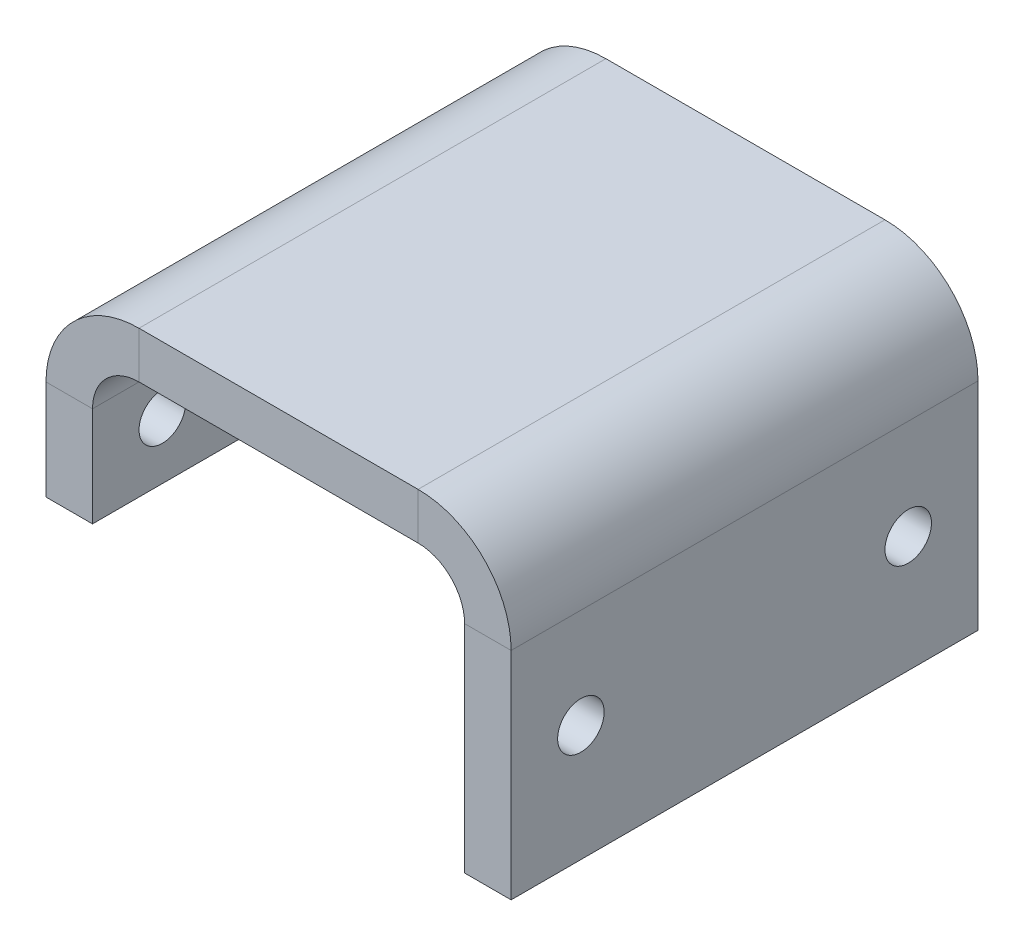
ISO-10303-21;
HEADER;
FILE_DESCRIPTION(('STEP AP214'),'2;1');
FILE_NAME('part.step','',(''),(''),'','','');
FILE_SCHEMA(('AUTOMOTIVE_DESIGN { 1 0 10303 214 1 1 1 1 }'));
ENDSEC;
DATA;
#1=APPLICATION_CONTEXT('core data for automotive mechanical design processes');
#2=APPLICATION_PROTOCOL_DEFINITION('international standard','automotive_design',2000,#1);
#3=PRODUCT_CONTEXT('',#1,'mechanical');
#4=PRODUCT('Part','Part','',(#3));
#5=PRODUCT_RELATED_PRODUCT_CATEGORY('part','',(#4));
#6=PRODUCT_DEFINITION_FORMATION('','',#4);
#7=PRODUCT_DEFINITION_CONTEXT('part definition',#1,'design');
#8=PRODUCT_DEFINITION('design','',#6,#7);
#9=PRODUCT_DEFINITION_SHAPE('','',#8);
#10=(LENGTH_UNIT() NAMED_UNIT(*) SI_UNIT(.MILLI.,.METRE.));
#11=(NAMED_UNIT(*) PLANE_ANGLE_UNIT() SI_UNIT($,.RADIAN.));
#12=(NAMED_UNIT(*) SI_UNIT($,.STERADIAN.) SOLID_ANGLE_UNIT());
#13=UNCERTAINTY_MEASURE_WITH_UNIT(LENGTH_MEASURE(1.E-05),#10,'distance_accuracy_value','');
#14=(GEOMETRIC_REPRESENTATION_CONTEXT(3) GLOBAL_UNCERTAINTY_ASSIGNED_CONTEXT((#13)) GLOBAL_UNIT_ASSIGNED_CONTEXT((#10,
#11,#12)) REPRESENTATION_CONTEXT('',''));
#15=CARTESIAN_POINT('',(0.,0.,0.));
#16=DIRECTION('',(0.,0.,1.));
#17=DIRECTION('',(1.,0.,0.));
#18=AXIS2_PLACEMENT_3D('',#15,#16,#17);
#19=CARTESIAN_POINT('',(-35.,-4.,20.075));
#20=DIRECTION('',(0.,0.,1.));
#21=DIRECTION('',(1.,0.,0.));
#22=AXIS2_PLACEMENT_3D('',#19,#20,#21);
#23=PLANE('',#22);
#24=DIRECTION('',(1.,0.,0.));
#25=VECTOR('',#24,1.);
#26=CARTESIAN_POINT('',(-35.,-4.,20.075));
#27=LINE('',#26,#25);
#28=CARTESIAN_POINT('',(-17.,-4.,20.075));
#29=VERTEX_POINT('',#28);
#30=CARTESIAN_POINT('',(7.00000000000003,-4.,20.075));
#31=VERTEX_POINT('',#30);
#32=EDGE_CURVE('E221',#29,#31,#27,.T.);
#33=ORIENTED_EDGE('',*,*,#32,.T.);
#34=DIRECTION('',(0.,1.,0.));
#35=VECTOR('',#34,1.);
#36=CARTESIAN_POINT('',(7.00000000000003,-4.,20.075));
#37=LINE('',#36,#35);
#38=CARTESIAN_POINT('',(7.00000000000003,0.,20.075));
#39=VERTEX_POINT('',#38);
#40=EDGE_CURVE('E12',#31,#39,#37,.T.);
#41=ORIENTED_EDGE('',*,*,#40,.T.);
#42=DIRECTION('',(1.,0.,0.));
#43=VECTOR('',#42,1.);
#44=CARTESIAN_POINT('',(-35.,0.,20.075));
#45=LINE('',#44,#43);
#46=CARTESIAN_POINT('',(-17.,0.,20.075));
#47=VERTEX_POINT('',#46);
#48=EDGE_CURVE('E205',#47,#39,#45,.T.);
#49=ORIENTED_EDGE('',*,*,#48,.F.);
#50=DIRECTION('',(0.,1.,0.));
#51=VECTOR('',#50,1.);
#52=CARTESIAN_POINT('',(-17.,-4.,20.075));
#53=LINE('',#52,#51);
#54=EDGE_CURVE('E210',#29,#47,#53,.T.);
#55=ORIENTED_EDGE('',*,*,#54,.F.);
#56=EDGE_LOOP('',(#33,#41,#49,#55));
#57=FACE_BOUND('',#56,.T.);
#58=ADVANCED_FACE('F47',(#57),#23,.T.);
#59=CARTESIAN_POINT('',(-35.,-4.,-20.075));
#60=DIRECTION('',(0.,0.,-1.));
#61=DIRECTION('',(-1.,0.,0.));
#62=AXIS2_PLACEMENT_3D('',#59,#60,#61);
#63=PLANE('',#62);
#64=DIRECTION('',(-1.,0.,0.));
#65=VECTOR('',#64,1.);
#66=CARTESIAN_POINT('',(-35.,0.,-20.075));
#67=LINE('',#66,#65);
#68=CARTESIAN_POINT('',(7.00000000000003,0.,-20.075));
#69=VERTEX_POINT('',#68);
#70=CARTESIAN_POINT('',(-17.,0.,-20.075));
#71=VERTEX_POINT('',#70);
#72=EDGE_CURVE('E206',#69,#71,#67,.T.);
#73=ORIENTED_EDGE('',*,*,#72,.F.);
#74=DIRECTION('',(0.,-1.,0.));
#75=VECTOR('',#74,1.);
#76=CARTESIAN_POINT('',(7.00000000000003,-4.,-20.075));
#77=LINE('',#76,#75);
#78=CARTESIAN_POINT('',(7.00000000000003,-4.,-20.075));
#79=VERTEX_POINT('',#78);
#80=EDGE_CURVE('E262',#69,#79,#77,.T.);
#81=ORIENTED_EDGE('',*,*,#80,.T.);
#82=DIRECTION('',(-1.,0.,0.));
#83=VECTOR('',#82,1.);
#84=CARTESIAN_POINT('',(-35.,-4.,-20.075));
#85=LINE('',#84,#83);
#86=CARTESIAN_POINT('',(-17.,-4.,-20.075));
#87=VERTEX_POINT('',#86);
#88=EDGE_CURVE('E50',#79,#87,#85,.T.);
#89=ORIENTED_EDGE('',*,*,#88,.T.);
#90=DIRECTION('',(0.,-1.,0.));
#91=VECTOR('',#90,1.);
#92=CARTESIAN_POINT('',(-17.,-4.,-20.075));
#93=LINE('',#92,#91);
#94=EDGE_CURVE('E207',#71,#87,#93,.T.);
#95=ORIENTED_EDGE('',*,*,#94,.F.);
#96=EDGE_LOOP('',(#73,#81,#89,#95));
#97=FACE_BOUND('',#96,.T.);
#98=ADVANCED_FACE('F275',(#97),#63,.T.);
#99=CARTESIAN_POINT('',(0.,-4.,0.));
#100=DIRECTION('',(0.,-1.,0.));
#101=DIRECTION('',(0.,0.,-1.));
#102=AXIS2_PLACEMENT_3D('',#99,#100,#101);
#103=PLANE('',#102);
#104=ORIENTED_EDGE('',*,*,#88,.F.);
#105=DIRECTION('',(0.,0.,1.));
#106=VECTOR('',#105,1.);
#107=CARTESIAN_POINT('',(7.00000000000003,-4.,0.));
#108=LINE('',#107,#106);
#109=EDGE_CURVE('E253',#79,#31,#108,.T.);
#110=ORIENTED_EDGE('',*,*,#109,.T.);
#111=ORIENTED_EDGE('',*,*,#32,.F.);
#112=DIRECTION('',(0.,0.,1.));
#113=VECTOR('',#112,1.);
#114=CARTESIAN_POINT('',(-17.,-4.,0.));
#115=LINE('',#114,#113);
#116=EDGE_CURVE('E197',#87,#29,#115,.T.);
#117=ORIENTED_EDGE('',*,*,#116,.F.);
#118=EDGE_LOOP('',(#104,#110,#111,#117));
#119=FACE_BOUND('',#118,.T.);
#120=ADVANCED_FACE('F278',(#119),#103,.T.);
#121=CARTESIAN_POINT('',(-21.,-16.5752220392306,20.075));
#122=DIRECTION('',(0.,0.,1.));
#123=DIRECTION('',(0.,1.,0.));
#124=AXIS2_PLACEMENT_3D('',#121,#122,#123);
#125=PLANE('',#124);
#126=DIRECTION('',(0.,1.,0.));
#127=VECTOR('',#126,1.);
#128=CARTESIAN_POINT('',(-21.,-16.5752220392306,20.075));
#129=LINE('',#128,#127);
#130=CARTESIAN_POINT('',(-21.,-16.5752220392306,20.075));
#131=VERTEX_POINT('',#130);
#132=CARTESIAN_POINT('',(-21.,-8.00000000000001,20.075));
#133=VERTEX_POINT('',#132);
#134=EDGE_CURVE('E231',#131,#133,#129,.T.);
#135=ORIENTED_EDGE('',*,*,#134,.T.);
#136=DIRECTION('',(-1.,0.,0.));
#137=VECTOR('',#136,1.);
#138=CARTESIAN_POINT('',(-21.,-8.00000000000001,20.075));
#139=LINE('',#138,#137);
#140=CARTESIAN_POINT('',(-25.,-8.00000000000004,20.075));
#141=VERTEX_POINT('',#140);
#142=EDGE_CURVE('E250',#133,#141,#139,.T.);
#143=ORIENTED_EDGE('',*,*,#142,.T.);
#144=DIRECTION('',(0.,1.,0.));
#145=VECTOR('',#144,1.);
#146=CARTESIAN_POINT('',(-25.,-16.5752220392306,20.075));
#147=LINE('',#146,#145);
#148=CARTESIAN_POINT('',(-25.,-16.5752220392306,20.075));
#149=VERTEX_POINT('',#148);
#150=EDGE_CURVE('E236',#149,#141,#147,.T.);
#151=ORIENTED_EDGE('',*,*,#150,.F.);
#152=DIRECTION('',(-1.,0.,0.));
#153=VECTOR('',#152,1.);
#154=CARTESIAN_POINT('',(-21.,-16.5752220392306,20.075));
#155=LINE('',#154,#153);
#156=EDGE_CURVE('E237',#131,#149,#155,.T.);
#157=ORIENTED_EDGE('',*,*,#156,.F.);
#158=EDGE_LOOP('',(#135,#143,#151,#157));
#159=FACE_BOUND('',#158,.T.);
#160=ADVANCED_FACE('F291',(#159),#125,.T.);
#161=CARTESIAN_POINT('',(-21.,-16.5752220392306,-20.075));
#162=DIRECTION('',(0.,0.,-1.));
#163=DIRECTION('',(0.,-1.,0.));
#164=AXIS2_PLACEMENT_3D('',#161,#162,#163);
#165=PLANE('',#164);
#166=DIRECTION('',(0.,-1.,0.));
#167=VECTOR('',#166,1.);
#168=CARTESIAN_POINT('',(-25.,-16.5752220392306,-20.075));
#169=LINE('',#168,#167);
#170=CARTESIAN_POINT('',(-25.,-8.00000000000004,-20.075));
#171=VERTEX_POINT('',#170);
#172=CARTESIAN_POINT('',(-25.,-16.5752220392306,-20.075));
#173=VERTEX_POINT('',#172);
#174=EDGE_CURVE('E225',#171,#173,#169,.T.);
#175=ORIENTED_EDGE('',*,*,#174,.F.);
#176=DIRECTION('',(1.,0.,0.));
#177=VECTOR('',#176,1.);
#178=CARTESIAN_POINT('',(-21.,-8.00000000000001,-20.075));
#179=LINE('',#178,#177);
#180=CARTESIAN_POINT('',(-21.,-8.00000000000002,-20.075));
#181=VERTEX_POINT('',#180);
#182=EDGE_CURVE('E245',#171,#181,#179,.T.);
#183=ORIENTED_EDGE('',*,*,#182,.T.);
#184=DIRECTION('',(0.,-1.,0.));
#185=VECTOR('',#184,1.);
#186=CARTESIAN_POINT('',(-21.,-16.5752220392306,-20.075));
#187=LINE('',#186,#185);
#188=CARTESIAN_POINT('',(-21.,-16.5752220392306,-20.075));
#189=VERTEX_POINT('',#188);
#190=EDGE_CURVE('E232',#181,#189,#187,.T.);
#191=ORIENTED_EDGE('',*,*,#190,.T.);
#192=DIRECTION('',(-1.,0.,0.));
#193=VECTOR('',#192,1.);
#194=CARTESIAN_POINT('',(-21.,-16.5752220392306,-20.075));
#195=LINE('',#194,#193);
#196=EDGE_CURVE('E240',#189,#173,#195,.T.);
#197=ORIENTED_EDGE('',*,*,#196,.T.);
#198=EDGE_LOOP('',(#175,#183,#191,#197));
#199=FACE_BOUND('',#198,.T.);
#200=ADVANCED_FACE('F299',(#199),#165,.T.);
#201=CARTESIAN_POINT('',(-21.0000000000001,18.4247779607694,0.));
#202=DIRECTION('',(1.,0.,0.));
#203=DIRECTION('',(0.,0.,-1.));
#204=AXIS2_PLACEMENT_3D('',#201,#202,#203);
#205=PLANE('',#204);
#206=CARTESIAN_POINT('',(-21.,-11.5752220392306,-14.075));
#207=DIRECTION('',(-1.,0.,0.));
#208=DIRECTION('',(0.,0.,1.));
#209=AXIS2_PLACEMENT_3D('',#206,#207,#208);
#210=CIRCLE('',#209,2.);
#211=CARTESIAN_POINT('',(-21.,-11.5752220392306,-12.075));
#212=VERTEX_POINT('',#211);
#213=EDGE_CURVE('E222',#212,#212,#210,.T.);
#214=ORIENTED_EDGE('',*,*,#213,.T.);
#215=EDGE_LOOP('',(#214));
#216=FACE_BOUND('',#215,.T.);
#217=CARTESIAN_POINT('',(-21.,-11.5752220392306,14.075));
#218=DIRECTION('',(-1.,0.,0.));
#219=DIRECTION('',(0.,0.,-1.));
#220=AXIS2_PLACEMENT_3D('',#217,#218,#219);
#221=CIRCLE('',#220,2.);
#222=CARTESIAN_POINT('',(-21.,-11.5752220392306,12.075));
#223=VERTEX_POINT('',#222);
#224=EDGE_CURVE('E214',#223,#223,#221,.T.);
#225=ORIENTED_EDGE('',*,*,#224,.T.);
#226=EDGE_LOOP('',(#225));
#227=FACE_BOUND('',#226,.T.);
#228=ORIENTED_EDGE('',*,*,#190,.F.);
#229=DIRECTION('',(0.,0.,1.));
#230=VECTOR('',#229,1.);
#231=CARTESIAN_POINT('',(-21.,-8.00000000000001,0.));
#232=LINE('',#231,#230);
#233=EDGE_CURVE('E239',#181,#133,#232,.T.);
#234=ORIENTED_EDGE('',*,*,#233,.T.);
#235=ORIENTED_EDGE('',*,*,#134,.F.);
#236=DIRECTION('',(0.,0.,1.));
#237=VECTOR('',#236,1.);
#238=CARTESIAN_POINT('',(-21.,-16.5752220392306,20.075));
#239=LINE('',#238,#237);
#240=EDGE_CURVE('E228',#189,#131,#239,.T.);
#241=ORIENTED_EDGE('',*,*,#240,.F.);
#242=EDGE_LOOP('',(#228,#234,#235,#241));
#243=FACE_BOUND('',#242,.T.);
#244=ADVANCED_FACE('F288',(#216,#227,#243),#205,.T.);
#245=CARTESIAN_POINT('',(-21.,-16.5752220392306,20.075));
#246=DIRECTION('',(0.,-1.,0.));
#247=DIRECTION('',(0.,0.,1.));
#248=AXIS2_PLACEMENT_3D('',#245,#246,#247);
#249=PLANE('',#248);
#250=DIRECTION('',(0.,0.,1.));
#251=VECTOR('',#250,1.);
#252=CARTESIAN_POINT('',(-25.,-16.5752220392306,20.075));
#253=LINE('',#252,#251);
#254=EDGE_CURVE('E233',#173,#149,#253,.T.);
#255=ORIENTED_EDGE('',*,*,#254,.F.);
#256=ORIENTED_EDGE('',*,*,#196,.F.);
#257=ORIENTED_EDGE('',*,*,#240,.T.);
#258=ORIENTED_EDGE('',*,*,#156,.T.);
#259=EDGE_LOOP('',(#255,#256,#257,#258));
#260=FACE_BOUND('',#259,.T.);
#261=ADVANCED_FACE('F296',(#260),#249,.T.);
#262=CARTESIAN_POINT('',(-25.0000000000001,18.4247779607694,0.));
#263=DIRECTION('',(1.,0.,0.));
#264=DIRECTION('',(0.,0.,-1.));
#265=AXIS2_PLACEMENT_3D('',#262,#263,#264);
#266=PLANE('',#265);
#267=DIRECTION('',(0.,0.,1.));
#268=VECTOR('',#267,1.);
#269=CARTESIAN_POINT('',(-25.,-8.00000000000003,0.));
#270=LINE('',#269,#268);
#271=EDGE_CURVE('E248',#171,#141,#270,.T.);
#272=ORIENTED_EDGE('',*,*,#271,.F.);
#273=ORIENTED_EDGE('',*,*,#174,.T.);
#274=ORIENTED_EDGE('',*,*,#254,.T.);
#275=ORIENTED_EDGE('',*,*,#150,.T.);
#276=EDGE_LOOP('',(#272,#273,#274,#275));
#277=FACE_BOUND('',#276,.T.);
#278=CARTESIAN_POINT('',(-25.,-11.5752220392306,14.075));
#279=DIRECTION('',(-1.,0.,0.));
#280=DIRECTION('',(0.,0.,-1.));
#281=AXIS2_PLACEMENT_3D('',#278,#279,#280);
#282=CIRCLE('',#281,2.);
#283=CARTESIAN_POINT('',(-25.,-11.5752220392306,12.075));
#284=VERTEX_POINT('',#283);
#285=EDGE_CURVE('E218',#284,#284,#282,.T.);
#286=ORIENTED_EDGE('',*,*,#285,.F.);
#287=EDGE_LOOP('',(#286));
#288=FACE_BOUND('',#287,.T.);
#289=CARTESIAN_POINT('',(-25.,-11.5752220392306,-14.075));
#290=DIRECTION('',(-1.,0.,0.));
#291=DIRECTION('',(0.,0.,1.));
#292=AXIS2_PLACEMENT_3D('',#289,#290,#291);
#293=CIRCLE('',#292,2.);
#294=CARTESIAN_POINT('',(-25.,-11.5752220392306,-12.075));
#295=VERTEX_POINT('',#294);
#296=EDGE_CURVE('E217',#295,#295,#293,.T.);
#297=ORIENTED_EDGE('',*,*,#296,.F.);
#298=EDGE_LOOP('',(#297));
#299=FACE_BOUND('',#298,.T.);
#300=ADVANCED_FACE('F380',(#277,#288,#299),#266,.F.);
#301=CARTESIAN_POINT('',(-21.,-11.5752220392306,-14.075));
#302=DIRECTION('',(-1.,0.,0.));
#303=DIRECTION('',(0.,0.,1.));
#304=AXIS2_PLACEMENT_3D('',#301,#302,#303);
#305=CYLINDRICAL_SURFACE('',#304,2.);
#306=ORIENTED_EDGE('',*,*,#213,.F.);
#307=EDGE_LOOP('',(#306));
#308=FACE_BOUND('',#307,.T.);
#309=ORIENTED_EDGE('',*,*,#296,.T.);
#310=EDGE_LOOP('',(#309));
#311=FACE_BOUND('',#310,.T.);
#312=ADVANCED_FACE('F374',(#308,#311),#305,.F.);
#313=CARTESIAN_POINT('',(-21.,-11.5752220392306,14.075));
#314=DIRECTION('',(-1.,0.,0.));
#315=DIRECTION('',(0.,0.,1.));
#316=AXIS2_PLACEMENT_3D('',#313,#314,#315);
#317=CYLINDRICAL_SURFACE('',#316,2.);
#318=ORIENTED_EDGE('',*,*,#224,.F.);
#319=EDGE_LOOP('',(#318));
#320=FACE_BOUND('',#319,.T.);
#321=ORIENTED_EDGE('',*,*,#285,.T.);
#322=EDGE_LOOP('',(#321));
#323=FACE_BOUND('',#322,.T.);
#324=ADVANCED_FACE('F368',(#320,#323),#317,.F.);
#325=CARTESIAN_POINT('',(0.,0.,0.));
#326=DIRECTION('',(0.,-1.,0.));
#327=DIRECTION('',(0.,0.,-1.));
#328=AXIS2_PLACEMENT_3D('',#325,#326,#327);
#329=PLANE('',#328);
#330=DIRECTION('',(0.,0.,1.));
#331=VECTOR('',#330,1.);
#332=CARTESIAN_POINT('',(7.00000000000003,0.,0.));
#333=LINE('',#332,#331);
#334=EDGE_CURVE('E55',#69,#39,#333,.T.);
#335=ORIENTED_EDGE('',*,*,#334,.F.);
#336=ORIENTED_EDGE('',*,*,#72,.T.);
#337=DIRECTION('',(0.,0.,1.));
#338=VECTOR('',#337,1.);
#339=CARTESIAN_POINT('',(-17.,0.,0.));
#340=LINE('',#339,#338);
#341=EDGE_CURVE('E202',#71,#47,#340,.T.);
#342=ORIENTED_EDGE('',*,*,#341,.T.);
#343=ORIENTED_EDGE('',*,*,#48,.T.);
#344=EDGE_LOOP('',(#335,#336,#342,#343));
#345=FACE_BOUND('',#344,.T.);
#346=ADVANCED_FACE('F304',(#345),#329,.F.);
#347=CARTESIAN_POINT('',(-17.,-8.,-20.075));
#348=DIRECTION('',(0.,0.,1.));
#349=DIRECTION('',(1.,0.,0.));
#350=AXIS2_PLACEMENT_3D('',#347,#348,#349);
#351=PLANE('',#350);
#352=ORIENTED_EDGE('',*,*,#182,.F.);
#353=CARTESIAN_POINT('',(-17.,-8.,-20.075));
#354=DIRECTION('',(0.,0.,-1.));
#355=DIRECTION('',(-1.,0.,0.));
#356=AXIS2_PLACEMENT_3D('',#353,#354,#355);
#357=CIRCLE('',#356,8.);
#358=EDGE_CURVE('E188',#171,#71,#357,.T.);
#359=ORIENTED_EDGE('',*,*,#358,.T.);
#360=ORIENTED_EDGE('',*,*,#94,.T.);
#361=CARTESIAN_POINT('',(-17.,-8.,-20.075));
#362=DIRECTION('',(0.,0.,-1.));
#363=DIRECTION('',(1.,0.,0.));
#364=AXIS2_PLACEMENT_3D('',#361,#362,#363);
#365=CIRCLE('',#364,4.);
#366=EDGE_CURVE('E192',#181,#87,#365,.T.);
#367=ORIENTED_EDGE('',*,*,#366,.F.);
#368=EDGE_LOOP('',(#352,#359,#360,#367));
#369=FACE_BOUND('',#368,.T.);
#370=ADVANCED_FACE('F282',(#369),#351,.F.);
#371=CARTESIAN_POINT('',(-17.,-8.,20.075));
#372=DIRECTION('',(0.,0.,-1.));
#373=DIRECTION('',(-1.,0.,0.));
#374=AXIS2_PLACEMENT_3D('',#371,#372,#373);
#375=PLANE('',#374);
#376=CARTESIAN_POINT('',(-17.,-8.,20.075));
#377=DIRECTION('',(0.,0.,-1.));
#378=DIRECTION('',(-1.,0.,0.));
#379=AXIS2_PLACEMENT_3D('',#376,#377,#378);
#380=CIRCLE('',#379,8.);
#381=EDGE_CURVE('E195',#47,#141,#380,.F.);
#382=ORIENTED_EDGE('',*,*,#381,.T.);
#383=ORIENTED_EDGE('',*,*,#142,.F.);
#384=CARTESIAN_POINT('',(-17.,-8.,20.075));
#385=DIRECTION('',(0.,0.,1.));
#386=DIRECTION('',(-1.,0.,0.));
#387=AXIS2_PLACEMENT_3D('',#384,#385,#386);
#388=CIRCLE('',#387,4.);
#389=EDGE_CURVE('E70',#29,#133,#388,.T.);
#390=ORIENTED_EDGE('',*,*,#389,.F.);
#391=ORIENTED_EDGE('',*,*,#54,.T.);
#392=EDGE_LOOP('',(#382,#383,#390,#391));
#393=FACE_BOUND('',#392,.T.);
#394=ADVANCED_FACE('F306',(#393),#375,.F.);
#395=CARTESIAN_POINT('',(-17.,-8.,41.4348758850537));
#396=DIRECTION('',(0.,0.,-1.));
#397=DIRECTION('',(-1.,0.,0.));
#398=AXIS2_PLACEMENT_3D('',#395,#396,#397);
#399=CYLINDRICAL_SURFACE('',#398,4.);
#400=ORIENTED_EDGE('',*,*,#116,.T.);
#401=ORIENTED_EDGE('',*,*,#389,.T.);
#402=ORIENTED_EDGE('',*,*,#233,.F.);
#403=ORIENTED_EDGE('',*,*,#366,.T.);
#404=EDGE_LOOP('',(#400,#401,#402,#403));
#405=FACE_BOUND('',#404,.T.);
#406=ADVANCED_FACE('F285',(#405),#399,.F.);
#407=CARTESIAN_POINT('',(-17.,-8.,41.4348758850537));
#408=DIRECTION('',(0.,0.,-1.));
#409=DIRECTION('',(-1.,0.,0.));
#410=AXIS2_PLACEMENT_3D('',#407,#408,#409);
#411=CYLINDRICAL_SURFACE('',#410,8.);
#412=ORIENTED_EDGE('',*,*,#341,.F.);
#413=ORIENTED_EDGE('',*,*,#358,.F.);
#414=ORIENTED_EDGE('',*,*,#271,.T.);
#415=ORIENTED_EDGE('',*,*,#381,.F.);
#416=EDGE_LOOP('',(#412,#413,#414,#415));
#417=FACE_BOUND('',#416,.T.);
#418=ADVANCED_FACE('F302',(#417),#411,.T.);
#419=CARTESIAN_POINT('',(7.00000000000003,-8.,-20.075));
#420=DIRECTION('',(0.,0.,1.));
#421=DIRECTION('',(1.,0.,0.));
#422=AXIS2_PLACEMENT_3D('',#419,#420,#421);
#423=PLANE('',#422);
#424=ORIENTED_EDGE('',*,*,#80,.F.);
#425=CARTESIAN_POINT('',(7.00000000000003,-8.,-20.075));
#426=DIRECTION('',(0.,0.,1.));
#427=DIRECTION('',(1.,0.,0.));
#428=AXIS2_PLACEMENT_3D('',#425,#426,#427);
#429=CIRCLE('',#428,8.);
#430=CARTESIAN_POINT('',(15.,-8.00000000000003,-20.075));
#431=VERTEX_POINT('',#430);
#432=EDGE_CURVE('E156',#69,#431,#429,.F.);
#433=ORIENTED_EDGE('',*,*,#432,.T.);
#434=DIRECTION('',(-1.,0.,0.));
#435=VECTOR('',#434,1.);
#436=CARTESIAN_POINT('',(11.,-8.00000000000001,-20.075));
#437=LINE('',#436,#435);
#438=CARTESIAN_POINT('',(11.,-8.00000000000001,-20.075));
#439=VERTEX_POINT('',#438);
#440=EDGE_CURVE('E175',#431,#439,#437,.T.);
#441=ORIENTED_EDGE('',*,*,#440,.T.);
#442=CARTESIAN_POINT('',(7.00000000000003,-8.,-20.075));
#443=DIRECTION('',(0.,0.,-1.));
#444=DIRECTION('',(1.,0.,0.));
#445=AXIS2_PLACEMENT_3D('',#442,#443,#444);
#446=CIRCLE('',#445,4.);
#447=EDGE_CURVE('E181',#79,#439,#446,.T.);
#448=ORIENTED_EDGE('',*,*,#447,.F.);
#449=EDGE_LOOP('',(#424,#433,#441,#448));
#450=FACE_BOUND('',#449,.T.);
#451=ADVANCED_FACE('F323',(#450),#423,.F.);
#452=CARTESIAN_POINT('',(7.00000000000003,-8.,20.075));
#453=DIRECTION('',(0.,0.,-1.));
#454=DIRECTION('',(-1.,0.,0.));
#455=AXIS2_PLACEMENT_3D('',#452,#453,#454);
#456=PLANE('',#455);
#457=DIRECTION('',(1.,0.,0.));
#458=VECTOR('',#457,1.);
#459=CARTESIAN_POINT('',(11.,-8.00000000000001,20.075));
#460=LINE('',#459,#458);
#461=CARTESIAN_POINT('',(11.,-8.00000000000001,20.075));
#462=VERTEX_POINT('',#461);
#463=CARTESIAN_POINT('',(15.,-8.00000000000003,20.075));
#464=VERTEX_POINT('',#463);
#465=EDGE_CURVE('E145',#462,#464,#460,.T.);
#466=ORIENTED_EDGE('',*,*,#465,.T.);
#467=CARTESIAN_POINT('',(7.00000000000003,-8.,20.075));
#468=DIRECTION('',(0.,0.,1.));
#469=DIRECTION('',(1.,0.,0.));
#470=AXIS2_PLACEMENT_3D('',#467,#468,#469);
#471=CIRCLE('',#470,8.);
#472=EDGE_CURVE('E185',#464,#39,#471,.T.);
#473=ORIENTED_EDGE('',*,*,#472,.T.);
#474=ORIENTED_EDGE('',*,*,#40,.F.);
#475=CARTESIAN_POINT('',(7.00000000000003,-8.,20.075));
#476=DIRECTION('',(0.,0.,1.));
#477=DIRECTION('',(-1.,0.,0.));
#478=AXIS2_PLACEMENT_3D('',#475,#476,#477);
#479=CIRCLE('',#478,4.);
#480=EDGE_CURVE('E184',#462,#31,#479,.T.);
#481=ORIENTED_EDGE('',*,*,#480,.F.);
#482=EDGE_LOOP('',(#466,#473,#474,#481));
#483=FACE_BOUND('',#482,.T.);
#484=ADVANCED_FACE('F310',(#483),#456,.F.);
#485=CARTESIAN_POINT('',(7.00000000000003,-8.,-41.4348758850537));
#486=DIRECTION('',(0.,0.,1.));
#487=DIRECTION('',(1.,0.,0.));
#488=AXIS2_PLACEMENT_3D('',#485,#486,#487);
#489=CYLINDRICAL_SURFACE('',#488,4.);
#490=ORIENTED_EDGE('',*,*,#480,.T.);
#491=ORIENTED_EDGE('',*,*,#109,.F.);
#492=ORIENTED_EDGE('',*,*,#447,.T.);
#493=DIRECTION('',(0.,0.,1.));
#494=VECTOR('',#493,1.);
#495=CARTESIAN_POINT('',(11.,-8.00000000000002,0.));
#496=LINE('',#495,#494);
#497=EDGE_CURVE('E179',#439,#462,#496,.T.);
#498=ORIENTED_EDGE('',*,*,#497,.T.);
#499=EDGE_LOOP('',(#490,#491,#492,#498));
#500=FACE_BOUND('',#499,.T.);
#501=ADVANCED_FACE('F313',(#500),#489,.F.);
#502=CARTESIAN_POINT('',(7.00000000000003,-8.,-41.4348758850537));
#503=DIRECTION('',(0.,0.,1.));
#504=DIRECTION('',(1.,0.,0.));
#505=AXIS2_PLACEMENT_3D('',#502,#503,#504);
#506=CYLINDRICAL_SURFACE('',#505,8.);
#507=ORIENTED_EDGE('',*,*,#472,.F.);
#508=DIRECTION('',(0.,0.,1.));
#509=VECTOR('',#508,1.);
#510=CARTESIAN_POINT('',(15.,-8.00000000000003,0.));
#511=LINE('',#510,#509);
#512=EDGE_CURVE('E326',#431,#464,#511,.T.);
#513=ORIENTED_EDGE('',*,*,#512,.F.);
#514=ORIENTED_EDGE('',*,*,#432,.F.);
#515=ORIENTED_EDGE('',*,*,#334,.T.);
#516=EDGE_LOOP('',(#507,#513,#514,#515));
#517=FACE_BOUND('',#516,.T.);
#518=ADVANCED_FACE('F324',(#517),#506,.T.);
#519=CARTESIAN_POINT('',(11.,-16.5752220392306,-14.075));
#520=DIRECTION('',(1.,0.,0.));
#521=DIRECTION('',(0.,0.,1.));
#522=AXIS2_PLACEMENT_3D('',#519,#520,#521);
#523=CYLINDRICAL_SURFACE('',#522,2.);
#524=CARTESIAN_POINT('',(11.,-16.5752220392306,-14.075));
#525=DIRECTION('',(1.,0.,0.));
#526=DIRECTION('',(0.,0.,1.));
#527=AXIS2_PLACEMENT_3D('',#524,#525,#526);
#528=CIRCLE('',#527,2.);
#529=CARTESIAN_POINT('',(11.,-16.5752220392306,-12.075));
#530=VERTEX_POINT('',#529);
#531=EDGE_CURVE('E320',#530,#530,#528,.T.);
#532=ORIENTED_EDGE('',*,*,#531,.F.);
#533=EDGE_LOOP('',(#532));
#534=FACE_BOUND('',#533,.T.);
#535=CARTESIAN_POINT('',(15.,-16.5752220392306,-14.075));
#536=DIRECTION('',(1.,0.,0.));
#537=DIRECTION('',(0.,0.,1.));
#538=AXIS2_PLACEMENT_3D('',#535,#536,#537);
#539=CIRCLE('',#538,2.);
#540=CARTESIAN_POINT('',(15.,-16.5752220392306,-12.075));
#541=VERTEX_POINT('',#540);
#542=EDGE_CURVE('E169',#541,#541,#539,.T.);
#543=ORIENTED_EDGE('',*,*,#542,.T.);
#544=EDGE_LOOP('',(#543));
#545=FACE_BOUND('',#544,.T.);
#546=ADVANCED_FACE('F342',(#534,#545),#523,.F.);
#547=CARTESIAN_POINT('',(11.,-16.5752220392306,14.075));
#548=DIRECTION('',(1.,0.,0.));
#549=DIRECTION('',(0.,0.,1.));
#550=AXIS2_PLACEMENT_3D('',#547,#548,#549);
#551=CYLINDRICAL_SURFACE('',#550,2.);
#552=CARTESIAN_POINT('',(11.,-16.5752220392306,14.075));
#553=DIRECTION('',(1.,0.,0.));
#554=DIRECTION('',(0.,0.,-1.));
#555=AXIS2_PLACEMENT_3D('',#552,#553,#554);
#556=CIRCLE('',#555,2.);
#557=CARTESIAN_POINT('',(11.,-16.5752220392306,12.075));
#558=VERTEX_POINT('',#557);
#559=EDGE_CURVE('E166',#558,#558,#556,.T.);
#560=ORIENTED_EDGE('',*,*,#559,.F.);
#561=EDGE_LOOP('',(#560));
#562=FACE_BOUND('',#561,.T.);
#563=CARTESIAN_POINT('',(15.,-16.5752220392306,14.075));
#564=DIRECTION('',(1.,0.,0.));
#565=DIRECTION('',(0.,0.,-1.));
#566=AXIS2_PLACEMENT_3D('',#563,#564,#565);
#567=CIRCLE('',#566,2.);
#568=CARTESIAN_POINT('',(15.,-16.5752220392306,12.075));
#569=VERTEX_POINT('',#568);
#570=EDGE_CURVE('E164',#569,#569,#567,.T.);
#571=ORIENTED_EDGE('',*,*,#570,.T.);
#572=EDGE_LOOP('',(#571));
#573=FACE_BOUND('',#572,.T.);
#574=ADVANCED_FACE('F339',(#562,#573),#551,.F.);
#575=CARTESIAN_POINT('',(11.,-26.5752220392306,20.075));
#576=DIRECTION('',(0.,-1.,0.));
#577=DIRECTION('',(0.,0.,-1.));
#578=AXIS2_PLACEMENT_3D('',#575,#576,#577);
#579=PLANE('',#578);
#580=DIRECTION('',(0.,0.,-1.));
#581=VECTOR('',#580,1.);
#582=CARTESIAN_POINT('',(15.,-26.5752220392306,20.075));
#583=LINE('',#582,#581);
#584=CARTESIAN_POINT('',(15.,-26.5752220392306,20.075));
#585=VERTEX_POINT('',#584);
#586=CARTESIAN_POINT('',(15.,-26.5752220392306,-20.075));
#587=VERTEX_POINT('',#586);
#588=EDGE_CURVE('E149',#585,#587,#583,.T.);
#589=ORIENTED_EDGE('',*,*,#588,.F.);
#590=DIRECTION('',(1.,0.,0.));
#591=VECTOR('',#590,1.);
#592=CARTESIAN_POINT('',(11.,-26.5752220392306,20.075));
#593=LINE('',#592,#591);
#594=CARTESIAN_POINT('',(11.,-26.5752220392306,20.075));
#595=VERTEX_POINT('',#594);
#596=EDGE_CURVE('E142',#595,#585,#593,.T.);
#597=ORIENTED_EDGE('',*,*,#596,.F.);
#598=DIRECTION('',(0.,0.,-1.));
#599=VECTOR('',#598,1.);
#600=CARTESIAN_POINT('',(11.,-26.5752220392306,20.075));
#601=LINE('',#600,#599);
#602=CARTESIAN_POINT('',(11.,-26.5752220392306,-20.075));
#603=VERTEX_POINT('',#602);
#604=EDGE_CURVE('E154',#595,#603,#601,.T.);
#605=ORIENTED_EDGE('',*,*,#604,.T.);
#606=DIRECTION('',(1.,0.,0.));
#607=VECTOR('',#606,1.);
#608=CARTESIAN_POINT('',(11.,-26.5752220392306,-20.075));
#609=LINE('',#608,#607);
#610=EDGE_CURVE('E163',#603,#587,#609,.T.);
#611=ORIENTED_EDGE('',*,*,#610,.T.);
#612=EDGE_LOOP('',(#589,#597,#605,#611));
#613=FACE_BOUND('',#612,.T.);
#614=ADVANCED_FACE('F153',(#613),#579,.T.);
#615=CARTESIAN_POINT('',(11.0000000000001,8.42477796076941,0.));
#616=DIRECTION('',(-1.,0.,0.));
#617=DIRECTION('',(0.,0.,-1.));
#618=AXIS2_PLACEMENT_3D('',#615,#616,#617);
#619=PLANE('',#618);
#620=ORIENTED_EDGE('',*,*,#497,.F.);
#621=DIRECTION('',(0.,1.,0.));
#622=VECTOR('',#621,1.);
#623=CARTESIAN_POINT('',(11.0000000000002,43.4247779607694,-20.075));
#624=LINE('',#623,#622);
#625=EDGE_CURVE('E162',#603,#439,#624,.T.);
#626=ORIENTED_EDGE('',*,*,#625,.F.);
#627=ORIENTED_EDGE('',*,*,#604,.F.);
#628=DIRECTION('',(0.,-1.,0.));
#629=VECTOR('',#628,1.);
#630=CARTESIAN_POINT('',(11.0000000000002,43.4247779607694,20.075));
#631=LINE('',#630,#629);
#632=EDGE_CURVE('E139',#462,#595,#631,.T.);
#633=ORIENTED_EDGE('',*,*,#632,.F.);
#634=EDGE_LOOP('',(#620,#626,#627,#633));
#635=FACE_BOUND('',#634,.T.);
#636=ORIENTED_EDGE('',*,*,#559,.T.);
#637=EDGE_LOOP('',(#636));
#638=FACE_BOUND('',#637,.T.);
#639=ORIENTED_EDGE('',*,*,#531,.T.);
#640=EDGE_LOOP('',(#639));
#641=FACE_BOUND('',#640,.T.);
#642=ADVANCED_FACE('F159',(#635,#638,#641),#619,.T.);
#643=CARTESIAN_POINT('',(11.0000000000002,43.4247779607694,-20.075));
#644=DIRECTION('',(0.,0.,-1.));
#645=DIRECTION('',(0.,1.,0.));
#646=AXIS2_PLACEMENT_3D('',#643,#644,#645);
#647=PLANE('',#646);
#648=ORIENTED_EDGE('',*,*,#440,.F.);
#649=DIRECTION('',(0.,1.,0.));
#650=VECTOR('',#649,1.);
#651=CARTESIAN_POINT('',(15.0000000000002,43.4247779607694,-20.075));
#652=LINE('',#651,#650);
#653=EDGE_CURVE('E319',#587,#431,#652,.T.);
#654=ORIENTED_EDGE('',*,*,#653,.F.);
#655=ORIENTED_EDGE('',*,*,#610,.F.);
#656=ORIENTED_EDGE('',*,*,#625,.T.);
#657=EDGE_LOOP('',(#648,#654,#655,#656));
#658=FACE_BOUND('',#657,.T.);
#659=ADVANCED_FACE('F316',(#658),#647,.T.);
#660=CARTESIAN_POINT('',(15.0000000000001,8.4247779607694,0.));
#661=DIRECTION('',(-1.,0.,0.));
#662=DIRECTION('',(0.,0.,-1.));
#663=AXIS2_PLACEMENT_3D('',#660,#661,#662);
#664=PLANE('',#663);
#665=ORIENTED_EDGE('',*,*,#542,.F.);
#666=EDGE_LOOP('',(#665));
#667=FACE_BOUND('',#666,.T.);
#668=ORIENTED_EDGE('',*,*,#570,.F.);
#669=EDGE_LOOP('',(#668));
#670=FACE_BOUND('',#669,.T.);
#671=ORIENTED_EDGE('',*,*,#653,.T.);
#672=ORIENTED_EDGE('',*,*,#512,.T.);
#673=DIRECTION('',(0.,-1.,0.));
#674=VECTOR('',#673,1.);
#675=CARTESIAN_POINT('',(15.0000000000002,43.4247779607694,20.075));
#676=LINE('',#675,#674);
#677=EDGE_CURVE('E328',#464,#585,#676,.T.);
#678=ORIENTED_EDGE('',*,*,#677,.T.);
#679=ORIENTED_EDGE('',*,*,#588,.T.);
#680=EDGE_LOOP('',(#671,#672,#678,#679));
#681=FACE_BOUND('',#680,.T.);
#682=ADVANCED_FACE('F346',(#667,#670,#681),#664,.F.);
#683=CARTESIAN_POINT('',(11.0000000000002,43.4247779607694,20.075));
#684=DIRECTION('',(0.,0.,1.));
#685=DIRECTION('',(0.,-1.,0.));
#686=AXIS2_PLACEMENT_3D('',#683,#684,#685);
#687=PLANE('',#686);
#688=ORIENTED_EDGE('',*,*,#465,.F.);
#689=ORIENTED_EDGE('',*,*,#632,.T.);
#690=ORIENTED_EDGE('',*,*,#596,.T.);
#691=ORIENTED_EDGE('',*,*,#677,.F.);
#692=EDGE_LOOP('',(#688,#689,#690,#691));
#693=FACE_BOUND('',#692,.T.);
#694=ADVANCED_FACE('F141',(#693),#687,.T.);
#695=CLOSED_SHELL('',(#58,#98,#120,#160,#200,#244,#261,#300,#312,#324,#346,#370,#394,#406,#418,
#451,#484,#501,#518,#546,#574,#614,#642,#659,#682,#694));
#696=MANIFOLD_SOLID_BREP('B2',#695);
#697=ADVANCED_BREP_SHAPE_REPRESENTATION('',(#18,#696),#14);
#698=SHAPE_DEFINITION_REPRESENTATION(#9,#697);
ENDSEC;
END-ISO-10303-21;
